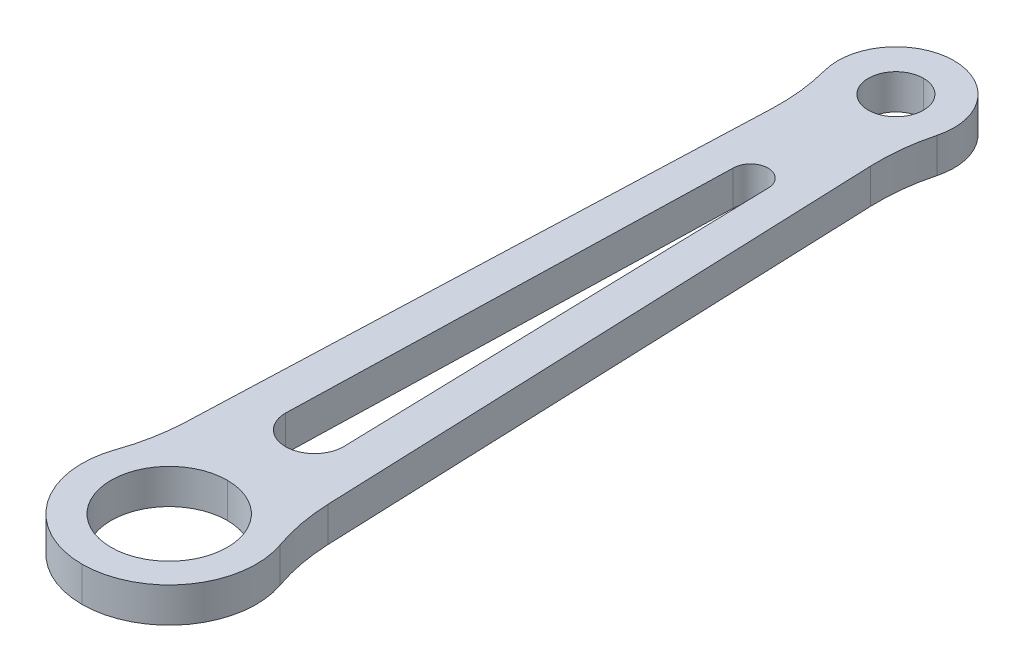
ISO-10303-21;
HEADER;
FILE_DESCRIPTION(('STEP AP214'),'2;1');
FILE_NAME('part.step','',(''),(''),'','','');
FILE_SCHEMA(('AUTOMOTIVE_DESIGN { 1 0 10303 214 1 1 1 1 }'));
ENDSEC;
DATA;
#1=APPLICATION_CONTEXT('core data for automotive mechanical design processes');
#2=APPLICATION_PROTOCOL_DEFINITION('international standard','automotive_design',2000,#1);
#3=PRODUCT_CONTEXT('',#1,'mechanical');
#4=PRODUCT('Part','Part','',(#3));
#5=PRODUCT_RELATED_PRODUCT_CATEGORY('part','',(#4));
#6=PRODUCT_DEFINITION_FORMATION('','',#4);
#7=PRODUCT_DEFINITION_CONTEXT('part definition',#1,'design');
#8=PRODUCT_DEFINITION('design','',#6,#7);
#9=PRODUCT_DEFINITION_SHAPE('','',#8);
#10=(LENGTH_UNIT() NAMED_UNIT(*) SI_UNIT(.MILLI.,.METRE.));
#11=(NAMED_UNIT(*) PLANE_ANGLE_UNIT() SI_UNIT($,.RADIAN.));
#12=(NAMED_UNIT(*) SI_UNIT($,.STERADIAN.) SOLID_ANGLE_UNIT());
#13=UNCERTAINTY_MEASURE_WITH_UNIT(LENGTH_MEASURE(1.E-05),#10,'distance_accuracy_value','');
#14=(GEOMETRIC_REPRESENTATION_CONTEXT(3) GLOBAL_UNCERTAINTY_ASSIGNED_CONTEXT((#13)) GLOBAL_UNIT_ASSIGNED_CONTEXT((#10,
#11,#12)) REPRESENTATION_CONTEXT('',''));
#15=CARTESIAN_POINT('',(0.,0.,0.));
#16=DIRECTION('',(0.,0.,1.));
#17=DIRECTION('',(1.,0.,0.));
#18=AXIS2_PLACEMENT_3D('',#15,#16,#17);
#19=CARTESIAN_POINT('',(0.,-13.,0.));
#20=DIRECTION('',(0.,1.,0.));
#21=DIRECTION('',(0.,0.,1.));
#22=AXIS2_PLACEMENT_3D('',#19,#20,#21);
#23=CYLINDRICAL_SURFACE('',#22,30.);
#24=CARTESIAN_POINT('',(0.,0.,0.));
#25=DIRECTION('',(0.,1.,0.));
#26=DIRECTION('',(0.,0.,1.));
#27=AXIS2_PLACEMENT_3D('',#24,#25,#26);
#28=CIRCLE('',#27,30.);
#29=CARTESIAN_POINT('',(-28.3278152506677,0.,-9.87597504675045));
#30=VERTEX_POINT('',#29);
#31=CARTESIAN_POINT('',(0.,0.,30.));
#32=VERTEX_POINT('',#31);
#33=EDGE_CURVE('E11',#30,#32,#28,.T.);
#34=ORIENTED_EDGE('',*,*,#33,.T.);
#35=DIRECTION('',(0.,1.,0.));
#36=VECTOR('',#35,1.);
#37=CARTESIAN_POINT('',(0.,-13.,30.));
#38=LINE('',#37,#36);
#39=CARTESIAN_POINT('',(0.,12.,30.));
#40=VERTEX_POINT('',#39);
#41=EDGE_CURVE('E28',#32,#40,#38,.T.);
#42=ORIENTED_EDGE('',*,*,#41,.T.);
#43=CARTESIAN_POINT('',(0.,12.,0.));
#44=DIRECTION('',(0.,1.,0.));
#45=DIRECTION('',(0.,0.,1.));
#46=AXIS2_PLACEMENT_3D('',#43,#44,#45);
#47=CIRCLE('',#46,30.);
#48=CARTESIAN_POINT('',(-28.3278152506677,12.,-9.87597504675045));
#49=VERTEX_POINT('',#48);
#50=EDGE_CURVE('E279',#49,#40,#47,.T.);
#51=ORIENTED_EDGE('',*,*,#50,.F.);
#52=DIRECTION('',(0.,1.,0.));
#53=VECTOR('',#52,1.);
#54=CARTESIAN_POINT('',(-28.3278152506677,-13.,-9.87597504675045));
#55=LINE('',#54,#53);
#56=EDGE_CURVE('E345',#30,#49,#55,.T.);
#57=ORIENTED_EDGE('',*,*,#56,.F.);
#58=EDGE_LOOP('',(#34,#42,#51,#57));
#59=FACE_BOUND('',#58,.T.);
#60=ADVANCED_FACE('F17',(#59),#23,.T.);
#61=CARTESIAN_POINT('',(0.,-13.,-50.));
#62=DIRECTION('',(0.,1.,0.));
#63=DIRECTION('',(0.,0.,1.));
#64=AXIS2_PLACEMENT_3D('',#61,#62,#63);
#65=CYLINDRICAL_SURFACE('',#64,10.);
#66=CARTESIAN_POINT('',(0.,0.,-50.));
#67=DIRECTION('',(0.,1.,0.));
#68=DIRECTION('',(0.,0.,1.));
#69=AXIS2_PLACEMENT_3D('',#66,#67,#68);
#70=CIRCLE('',#69,10.);
#71=CARTESIAN_POINT('',(0.,0.,-40.));
#72=VERTEX_POINT('',#71);
#73=CARTESIAN_POINT('',(10.,0.,-50.));
#74=VERTEX_POINT('',#73);
#75=EDGE_CURVE('E296',#72,#74,#70,.T.);
#76=ORIENTED_EDGE('',*,*,#75,.F.);
#77=DIRECTION('',(0.,1.,0.));
#78=VECTOR('',#77,1.);
#79=CARTESIAN_POINT('',(0.,-13.,-40.));
#80=LINE('',#79,#78);
#81=CARTESIAN_POINT('',(0.,12.,-40.));
#82=VERTEX_POINT('',#81);
#83=EDGE_CURVE('E266',#72,#82,#80,.T.);
#84=ORIENTED_EDGE('',*,*,#83,.T.);
#85=CARTESIAN_POINT('',(0.,12.,-50.));
#86=DIRECTION('',(0.,1.,0.));
#87=DIRECTION('',(0.,0.,1.));
#88=AXIS2_PLACEMENT_3D('',#85,#86,#87);
#89=CIRCLE('',#88,10.);
#90=CARTESIAN_POINT('',(10.,12.,-50.));
#91=VERTEX_POINT('',#90);
#92=EDGE_CURVE('E270',#82,#91,#89,.T.);
#93=ORIENTED_EDGE('',*,*,#92,.T.);
#94=DIRECTION('',(0.,1.,0.));
#95=VECTOR('',#94,1.);
#96=CARTESIAN_POINT('',(10.,-13.,-50.));
#97=LINE('',#96,#95);
#98=EDGE_CURVE('E289',#74,#91,#97,.T.);
#99=ORIENTED_EDGE('',*,*,#98,.F.);
#100=EDGE_LOOP('',(#76,#84,#93,#99));
#101=FACE_BOUND('',#100,.T.);
#102=ADVANCED_FACE('F430',(#101),#65,.F.);
#103=CARTESIAN_POINT('',(0.,-13.,0.));
#104=DIRECTION('',(0.,1.,0.));
#105=DIRECTION('',(0.,0.,1.));
#106=AXIS2_PLACEMENT_3D('',#103,#104,#105);
#107=CYLINDRICAL_SURFACE('',#106,19.9999971966483);
#108=CARTESIAN_POINT('',(0.,0.,0.));
#109=DIRECTION('',(0.,1.,0.));
#110=DIRECTION('',(0.,0.,1.));
#111=AXIS2_PLACEMENT_3D('',#108,#109,#110);
#112=CIRCLE('',#111,19.9999971966483);
#113=CARTESIAN_POINT('',(0.,0.,-19.9999971966483));
#114=VERTEX_POINT('',#113);
#115=CARTESIAN_POINT('',(0.,0.,19.9999971966483));
#116=VERTEX_POINT('',#115);
#117=EDGE_CURVE('E339',#114,#116,#112,.T.);
#118=ORIENTED_EDGE('',*,*,#117,.F.);
#119=DIRECTION('',(0.,1.,0.));
#120=VECTOR('',#119,1.);
#121=CARTESIAN_POINT('',(0.,-13.,-19.9999971966483));
#122=LINE('',#121,#120);
#123=CARTESIAN_POINT('',(0.,12.,-19.9999971966483));
#124=VERTEX_POINT('',#123);
#125=EDGE_CURVE('E283',#114,#124,#122,.T.);
#126=ORIENTED_EDGE('',*,*,#125,.T.);
#127=CARTESIAN_POINT('',(0.,12.,0.));
#128=DIRECTION('',(0.,1.,0.));
#129=DIRECTION('',(0.,0.,1.));
#130=AXIS2_PLACEMENT_3D('',#127,#128,#129);
#131=CIRCLE('',#130,19.9999971966483);
#132=CARTESIAN_POINT('',(0.,12.,19.9999971966483));
#133=VERTEX_POINT('',#132);
#134=EDGE_CURVE('E260',#124,#133,#131,.T.);
#135=ORIENTED_EDGE('',*,*,#134,.T.);
#136=DIRECTION('',(0.,1.,0.));
#137=VECTOR('',#136,1.);
#138=CARTESIAN_POINT('',(0.,-13.,19.9999971966483));
#139=LINE('',#138,#137);
#140=EDGE_CURVE('E234',#116,#133,#139,.T.);
#141=ORIENTED_EDGE('',*,*,#140,.F.);
#142=EDGE_LOOP('',(#118,#126,#135,#141));
#143=FACE_BOUND('',#142,.T.);
#144=ADVANCED_FACE('F447',(#143),#107,.F.);
#145=CARTESIAN_POINT('',(0.,12.,-250.));
#146=DIRECTION('',(0.,-1.,0.));
#147=DIRECTION('',(0.,0.,-1.));
#148=AXIS2_PLACEMENT_3D('',#145,#146,#147);
#149=CYLINDRICAL_SURFACE('',#148,9.5);
#150=CARTESIAN_POINT('',(0.,12.,-250.));
#151=DIRECTION('',(0.,1.,0.));
#152=DIRECTION('',(0.,0.,1.));
#153=AXIS2_PLACEMENT_3D('',#150,#151,#152);
#154=CIRCLE('',#153,9.5);
#155=CARTESIAN_POINT('',(0.,12.,-259.5));
#156=VERTEX_POINT('',#155);
#157=CARTESIAN_POINT('',(0.,12.,-240.5));
#158=VERTEX_POINT('',#157);
#159=EDGE_CURVE('E256',#156,#158,#154,.T.);
#160=ORIENTED_EDGE('',*,*,#159,.T.);
#161=DIRECTION('',(0.,-1.,0.));
#162=VECTOR('',#161,1.);
#163=CARTESIAN_POINT('',(0.,12.,-240.5));
#164=LINE('',#163,#162);
#165=CARTESIAN_POINT('',(0.,0.,-240.5));
#166=VERTEX_POINT('',#165);
#167=EDGE_CURVE('E261',#158,#166,#164,.T.);
#168=ORIENTED_EDGE('',*,*,#167,.T.);
#169=CARTESIAN_POINT('',(0.,0.,-250.));
#170=DIRECTION('',(0.,1.,0.));
#171=DIRECTION('',(0.,0.,1.));
#172=AXIS2_PLACEMENT_3D('',#169,#170,#171);
#173=CIRCLE('',#172,9.5);
#174=CARTESIAN_POINT('',(0.,0.,-259.5));
#175=VERTEX_POINT('',#174);
#176=EDGE_CURVE('E336',#175,#166,#173,.T.);
#177=ORIENTED_EDGE('',*,*,#176,.F.);
#178=DIRECTION('',(0.,-1.,0.));
#179=VECTOR('',#178,1.);
#180=CARTESIAN_POINT('',(0.,12.,-259.5));
#181=LINE('',#180,#179);
#182=EDGE_CURVE('E237',#156,#175,#181,.T.);
#183=ORIENTED_EDGE('',*,*,#182,.F.);
#184=EDGE_LOOP('',(#160,#168,#177,#183));
#185=FACE_BOUND('',#184,.T.);
#186=ADVANCED_FACE('F491',(#185),#149,.F.);
#187=CARTESIAN_POINT('',(0.,12.,0.));
#188=DIRECTION('',(0.,1.,0.));
#189=DIRECTION('',(1.,0.,0.));
#190=AXIS2_PLACEMENT_3D('',#187,#188,#189);
#191=PLANE('',#190);
#192=DIRECTION('',(0.0382406015651433,0.,-0.999268560694239));
#193=VECTOR('',#192,1.);
#194=CARTESIAN_POINT('',(-25.597124885427,12.,-0.979565946993043));
#195=LINE('',#194,#193);
#196=CARTESIAN_POINT('',(-24.4772515869624,12.,-30.2430747129414));
#197=VERTEX_POINT('',#196);
#198=CARTESIAN_POINT('',(-17.0516738536364,12.,-224.281506908194));
#199=VERTEX_POINT('',#198);
#200=EDGE_CURVE('E300',#197,#199,#195,.T.);
#201=ORIENTED_EDGE('',*,*,#200,.F.);
#202=CARTESIAN_POINT('',(-94.4260508355591,12.,-32.9199168225015));
#203=DIRECTION('',(0.,1.,0.));
#204=DIRECTION('',(0.,0.,1.));
#205=AXIS2_PLACEMENT_3D('',#202,#203,#204);
#206=CIRCLE('',#205,70.);
#207=EDGE_CURVE('E250',#49,#197,#206,.T.);
#208=ORIENTED_EDGE('',*,*,#207,.F.);
#209=ORIENTED_EDGE('',*,*,#50,.T.);
#210=CARTESIAN_POINT('',(0.,12.,0.));
#211=DIRECTION('',(0.,1.,0.));
#212=DIRECTION('',(0.,0.,1.));
#213=AXIS2_PLACEMENT_3D('',#210,#211,#212);
#214=CIRCLE('',#213,30.);
#215=CARTESIAN_POINT('',(28.3278152506677,12.,-9.87597504675047));
#216=VERTEX_POINT('',#215);
#217=EDGE_CURVE('E284',#40,#216,#214,.T.);
#218=ORIENTED_EDGE('',*,*,#217,.T.);
#219=CARTESIAN_POINT('',(94.4260508355591,12.,-32.9199168225015));
#220=DIRECTION('',(0.,-1.,0.));
#221=DIRECTION('',(0.,0.,1.));
#222=AXIS2_PLACEMENT_3D('',#219,#220,#221);
#223=CIRCLE('',#222,70.);
#224=CARTESIAN_POINT('',(24.4772515869624,12.,-30.2430747129414));
#225=VERTEX_POINT('',#224);
#226=EDGE_CURVE('E287',#216,#225,#223,.T.);
#227=ORIENTED_EDGE('',*,*,#226,.T.);
#228=DIRECTION('',(-0.0382406015651433,0.,-0.999268560694239));
#229=VECTOR('',#228,1.);
#230=CARTESIAN_POINT('',(25.597124885427,12.,-0.979565946993043));
#231=LINE('',#230,#229);
#232=CARTESIAN_POINT('',(17.0516738536364,12.,-224.281506908194));
#233=VERTEX_POINT('',#232);
#234=EDGE_CURVE('E193',#225,#233,#231,.T.);
#235=ORIENTED_EDGE('',*,*,#234,.T.);
#236=CARTESIAN_POINT('',(87.0004731022332,12.,-226.958349017755));
#237=DIRECTION('',(0.,-1.,0.));
#238=DIRECTION('',(0.,0.,1.));
#239=AXIS2_PLACEMENT_3D('',#236,#237,#238);
#240=CIRCLE('',#239,70.);
#241=CARTESIAN_POINT('',(19.333438467163,12.,-244.879633115056));
#242=VERTEX_POINT('',#241);
#243=EDGE_CURVE('E185',#233,#242,#240,.T.);
#244=ORIENTED_EDGE('',*,*,#243,.T.);
#245=CARTESIAN_POINT('',(0.,12.,-250.));
#246=DIRECTION('',(0.,1.,0.));
#247=DIRECTION('',(0.,0.,1.));
#248=AXIS2_PLACEMENT_3D('',#245,#246,#247);
#249=CIRCLE('',#248,20.);
#250=CARTESIAN_POINT('',(-19.333438467163,12.,-244.879633115056));
#251=VERTEX_POINT('',#250);
#252=EDGE_CURVE('E176',#242,#251,#249,.T.);
#253=ORIENTED_EDGE('',*,*,#252,.T.);
#254=CARTESIAN_POINT('',(-87.0004731022332,12.,-226.958349017755));
#255=DIRECTION('',(0.,1.,0.));
#256=DIRECTION('',(0.,0.,1.));
#257=AXIS2_PLACEMENT_3D('',#254,#255,#256);
#258=CIRCLE('',#257,70.);
#259=EDGE_CURVE('E265',#199,#251,#258,.T.);
#260=ORIENTED_EDGE('',*,*,#259,.F.);
#261=EDGE_LOOP('',(#201,#208,#209,#218,#227,#235,#244,#253,#260));
#262=FACE_BOUND('',#261,.T.);
#263=CARTESIAN_POINT('',(0.,12.,-50.));
#264=DIRECTION('',(0.,1.,0.));
#265=DIRECTION('',(0.,0.,1.));
#266=AXIS2_PLACEMENT_3D('',#263,#264,#265);
#267=CIRCLE('',#266,10.);
#268=CARTESIAN_POINT('',(-10.,12.,-50.));
#269=VERTEX_POINT('',#268);
#270=EDGE_CURVE('E227',#269,#82,#267,.T.);
#271=ORIENTED_EDGE('',*,*,#270,.F.);
#272=DIRECTION('',(-0.0266571902389802,0.,0.999644633961771));
#273=VECTOR('',#272,1.);
#274=CARTESIAN_POINT('',(-11.3252798010303,12.,-0.302007461360805));
#275=LINE('',#274,#273);
#276=CARTESIAN_POINT('',(-6.,12.,-200.));
#277=VERTEX_POINT('',#276);
#278=EDGE_CURVE('E320',#277,#269,#275,.T.);
#279=ORIENTED_EDGE('',*,*,#278,.F.);
#280=CARTESIAN_POINT('',(0.,12.,-200.));
#281=DIRECTION('',(0.,1.,0.));
#282=DIRECTION('',(0.,0.,1.));
#283=AXIS2_PLACEMENT_3D('',#280,#281,#282);
#284=CIRCLE('',#283,6.);
#285=CARTESIAN_POINT('',(6.,12.,-200.));
#286=VERTEX_POINT('',#285);
#287=EDGE_CURVE('E228',#286,#277,#284,.T.);
#288=ORIENTED_EDGE('',*,*,#287,.F.);
#289=DIRECTION('',(0.0266571902389802,0.,0.999644633961771));
#290=VECTOR('',#289,1.);
#291=CARTESIAN_POINT('',(11.3252798010303,12.,-0.302007461360805));
#292=LINE('',#291,#290);
#293=EDGE_CURVE('E186',#286,#91,#292,.T.);
#294=ORIENTED_EDGE('',*,*,#293,.T.);
#295=ORIENTED_EDGE('',*,*,#92,.F.);
#296=EDGE_LOOP('',(#271,#279,#288,#294,#295));
#297=FACE_BOUND('',#296,.T.);
#298=CARTESIAN_POINT('',(0.,12.,0.));
#299=DIRECTION('',(0.,1.,0.));
#300=DIRECTION('',(0.,0.,1.));
#301=AXIS2_PLACEMENT_3D('',#298,#299,#300);
#302=CIRCLE('',#301,19.9999971966483);
#303=EDGE_CURVE('E226',#133,#124,#302,.T.);
#304=ORIENTED_EDGE('',*,*,#303,.F.);
#305=ORIENTED_EDGE('',*,*,#134,.F.);
#306=EDGE_LOOP('',(#304,#305));
#307=FACE_BOUND('',#306,.T.);
#308=ORIENTED_EDGE('',*,*,#159,.F.);
#309=CARTESIAN_POINT('',(0.,12.,-250.));
#310=DIRECTION('',(0.,1.,0.));
#311=DIRECTION('',(0.,0.,1.));
#312=AXIS2_PLACEMENT_3D('',#309,#310,#311);
#313=CIRCLE('',#312,9.5);
#314=EDGE_CURVE('E252',#158,#156,#313,.T.);
#315=ORIENTED_EDGE('',*,*,#314,.F.);
#316=EDGE_LOOP('',(#308,#315));
#317=FACE_BOUND('',#316,.T.);
#318=ADVANCED_FACE('F190',(#262,#297,#307,#317),#191,.T.);
#319=CARTESIAN_POINT('',(0.,0.,0.));
#320=DIRECTION('',(0.,1.,0.));
#321=DIRECTION('',(1.,0.,0.));
#322=AXIS2_PLACEMENT_3D('',#319,#320,#321);
#323=PLANE('',#322);
#324=CARTESIAN_POINT('',(-94.4260508355591,0.,-32.9199168225015));
#325=DIRECTION('',(0.,1.,0.));
#326=DIRECTION('',(0.,0.,1.));
#327=AXIS2_PLACEMENT_3D('',#324,#325,#326);
#328=CIRCLE('',#327,70.);
#329=CARTESIAN_POINT('',(-24.4772515869624,0.,-30.2430747129414));
#330=VERTEX_POINT('',#329);
#331=EDGE_CURVE('E217',#30,#330,#328,.T.);
#332=ORIENTED_EDGE('',*,*,#331,.T.);
#333=DIRECTION('',(0.0382406015651433,0.,-0.999268560694239));
#334=VECTOR('',#333,1.);
#335=CARTESIAN_POINT('',(-25.597124885427,0.,-0.979565946993044));
#336=LINE('',#335,#334);
#337=CARTESIAN_POINT('',(-17.0516738536364,0.,-224.281506908194));
#338=VERTEX_POINT('',#337);
#339=EDGE_CURVE('E221',#330,#338,#336,.T.);
#340=ORIENTED_EDGE('',*,*,#339,.T.);
#341=CARTESIAN_POINT('',(-87.0004731022332,0.,-226.958349017755));
#342=DIRECTION('',(0.,1.,0.));
#343=DIRECTION('',(0.,0.,1.));
#344=AXIS2_PLACEMENT_3D('',#341,#342,#343);
#345=CIRCLE('',#344,70.);
#346=CARTESIAN_POINT('',(-19.333438467163,0.,-244.879633115056));
#347=VERTEX_POINT('',#346);
#348=EDGE_CURVE('E245',#338,#347,#345,.T.);
#349=ORIENTED_EDGE('',*,*,#348,.T.);
#350=CARTESIAN_POINT('',(0.,0.,-250.));
#351=DIRECTION('',(0.,1.,0.));
#352=DIRECTION('',(0.,0.,1.));
#353=AXIS2_PLACEMENT_3D('',#350,#351,#352);
#354=CIRCLE('',#353,20.);
#355=CARTESIAN_POINT('',(19.333438467163,0.,-244.879633115056));
#356=VERTEX_POINT('',#355);
#357=EDGE_CURVE('E155',#356,#347,#354,.T.);
#358=ORIENTED_EDGE('',*,*,#357,.F.);
#359=CARTESIAN_POINT('',(87.0004731022332,0.,-226.958349017755));
#360=DIRECTION('',(0.,-1.,0.));
#361=DIRECTION('',(0.,0.,1.));
#362=AXIS2_PLACEMENT_3D('',#359,#360,#361);
#363=CIRCLE('',#362,70.);
#364=CARTESIAN_POINT('',(17.0516738536364,0.,-224.281506908194));
#365=VERTEX_POINT('',#364);
#366=EDGE_CURVE('E200',#365,#356,#363,.T.);
#367=ORIENTED_EDGE('',*,*,#366,.F.);
#368=DIRECTION('',(-0.0382406015651433,0.,-0.999268560694239));
#369=VECTOR('',#368,1.);
#370=CARTESIAN_POINT('',(25.597124885427,0.,-0.979565946993044));
#371=LINE('',#370,#369);
#372=CARTESIAN_POINT('',(24.4772515869624,0.,-30.2430747129414));
#373=VERTEX_POINT('',#372);
#374=EDGE_CURVE('E301',#373,#365,#371,.T.);
#375=ORIENTED_EDGE('',*,*,#374,.F.);
#376=CARTESIAN_POINT('',(94.4260508355591,0.,-32.9199168225015));
#377=DIRECTION('',(0.,-1.,0.));
#378=DIRECTION('',(0.,0.,1.));
#379=AXIS2_PLACEMENT_3D('',#376,#377,#378);
#380=CIRCLE('',#379,70.);
#381=CARTESIAN_POINT('',(28.3278152506677,0.,-9.87597504675047));
#382=VERTEX_POINT('',#381);
#383=EDGE_CURVE('E314',#382,#373,#380,.T.);
#384=ORIENTED_EDGE('',*,*,#383,.F.);
#385=CARTESIAN_POINT('',(0.,0.,0.));
#386=DIRECTION('',(0.,1.,0.));
#387=DIRECTION('',(0.,0.,1.));
#388=AXIS2_PLACEMENT_3D('',#385,#386,#387);
#389=CIRCLE('',#388,30.);
#390=EDGE_CURVE('E247',#32,#382,#389,.T.);
#391=ORIENTED_EDGE('',*,*,#390,.F.);
#392=ORIENTED_EDGE('',*,*,#33,.F.);
#393=EDGE_LOOP('',(#332,#340,#349,#358,#367,#375,#384,#391,#392));
#394=FACE_BOUND('',#393,.T.);
#395=DIRECTION('',(-0.0266571902389802,0.,0.999644633961771));
#396=VECTOR('',#395,1.);
#397=CARTESIAN_POINT('',(-11.3252798010303,0.,-0.302007461360806));
#398=LINE('',#397,#396);
#399=CARTESIAN_POINT('',(-6.,0.,-200.));
#400=VERTEX_POINT('',#399);
#401=CARTESIAN_POINT('',(-10.,0.,-50.));
#402=VERTEX_POINT('',#401);
#403=EDGE_CURVE('E241',#400,#402,#398,.T.);
#404=ORIENTED_EDGE('',*,*,#403,.T.);
#405=CARTESIAN_POINT('',(0.,0.,-50.));
#406=DIRECTION('',(0.,1.,0.));
#407=DIRECTION('',(0.,0.,1.));
#408=AXIS2_PLACEMENT_3D('',#405,#406,#407);
#409=CIRCLE('',#408,10.);
#410=EDGE_CURVE('E246',#402,#72,#409,.T.);
#411=ORIENTED_EDGE('',*,*,#410,.T.);
#412=ORIENTED_EDGE('',*,*,#75,.T.);
#413=DIRECTION('',(0.0266571902389802,0.,0.999644633961771));
#414=VECTOR('',#413,1.);
#415=CARTESIAN_POINT('',(11.3252798010303,0.,-0.302007461360806));
#416=LINE('',#415,#414);
#417=CARTESIAN_POINT('',(6.,0.,-200.));
#418=VERTEX_POINT('',#417);
#419=EDGE_CURVE('E233',#418,#74,#416,.T.);
#420=ORIENTED_EDGE('',*,*,#419,.F.);
#421=CARTESIAN_POINT('',(0.,0.,-200.));
#422=DIRECTION('',(0.,1.,0.));
#423=DIRECTION('',(0.,0.,1.));
#424=AXIS2_PLACEMENT_3D('',#421,#422,#423);
#425=CIRCLE('',#424,6.);
#426=EDGE_CURVE('E293',#418,#400,#425,.T.);
#427=ORIENTED_EDGE('',*,*,#426,.T.);
#428=EDGE_LOOP('',(#404,#411,#412,#420,#427));
#429=FACE_BOUND('',#428,.T.);
#430=CARTESIAN_POINT('',(0.,0.,0.));
#431=DIRECTION('',(0.,1.,0.));
#432=DIRECTION('',(0.,0.,1.));
#433=AXIS2_PLACEMENT_3D('',#430,#431,#432);
#434=CIRCLE('',#433,19.9999971966483);
#435=EDGE_CURVE('E214',#116,#114,#434,.T.);
#436=ORIENTED_EDGE('',*,*,#435,.T.);
#437=ORIENTED_EDGE('',*,*,#117,.T.);
#438=EDGE_LOOP('',(#436,#437));
#439=FACE_BOUND('',#438,.T.);
#440=ORIENTED_EDGE('',*,*,#176,.T.);
#441=CARTESIAN_POINT('',(0.,0.,-250.));
#442=DIRECTION('',(0.,1.,0.));
#443=DIRECTION('',(0.,0.,1.));
#444=AXIS2_PLACEMENT_3D('',#441,#442,#443);
#445=CIRCLE('',#444,9.5);
#446=EDGE_CURVE('E21',#166,#175,#445,.T.);
#447=ORIENTED_EDGE('',*,*,#446,.T.);
#448=EDGE_LOOP('',(#440,#447));
#449=FACE_BOUND('',#448,.T.);
#450=ADVANCED_FACE('F384',(#394,#429,#439,#449),#323,.F.);
#451=CARTESIAN_POINT('',(0.,12.,-250.));
#452=DIRECTION('',(0.,-1.,0.));
#453=DIRECTION('',(0.,0.,-1.));
#454=AXIS2_PLACEMENT_3D('',#451,#452,#453);
#455=CYLINDRICAL_SURFACE('',#454,9.5);
#456=ORIENTED_EDGE('',*,*,#167,.F.);
#457=ORIENTED_EDGE('',*,*,#314,.T.);
#458=ORIENTED_EDGE('',*,*,#182,.T.);
#459=ORIENTED_EDGE('',*,*,#446,.F.);
#460=EDGE_LOOP('',(#456,#457,#458,#459));
#461=FACE_BOUND('',#460,.T.);
#462=ADVANCED_FACE('F19',(#461),#455,.F.);
#463=CARTESIAN_POINT('',(0.,-13.,0.));
#464=DIRECTION('',(0.,1.,0.));
#465=DIRECTION('',(0.,0.,1.));
#466=AXIS2_PLACEMENT_3D('',#463,#464,#465);
#467=CYLINDRICAL_SURFACE('',#466,19.9999971966483);
#468=ORIENTED_EDGE('',*,*,#125,.F.);
#469=ORIENTED_EDGE('',*,*,#435,.F.);
#470=ORIENTED_EDGE('',*,*,#140,.T.);
#471=ORIENTED_EDGE('',*,*,#303,.T.);
#472=EDGE_LOOP('',(#468,#469,#470,#471));
#473=FACE_BOUND('',#472,.T.);
#474=ADVANCED_FACE('F388',(#473),#467,.F.);
#475=CARTESIAN_POINT('',(0.,-13.,-50.));
#476=DIRECTION('',(0.,1.,0.));
#477=DIRECTION('',(0.,0.,1.));
#478=AXIS2_PLACEMENT_3D('',#475,#476,#477);
#479=CYLINDRICAL_SURFACE('',#478,10.);
#480=ORIENTED_EDGE('',*,*,#83,.F.);
#481=ORIENTED_EDGE('',*,*,#410,.F.);
#482=DIRECTION('',(0.,1.,0.));
#483=VECTOR('',#482,1.);
#484=CARTESIAN_POINT('',(-10.,-13.,-50.));
#485=LINE('',#484,#483);
#486=EDGE_CURVE('E222',#402,#269,#485,.T.);
#487=ORIENTED_EDGE('',*,*,#486,.T.);
#488=ORIENTED_EDGE('',*,*,#270,.T.);
#489=EDGE_LOOP('',(#480,#481,#487,#488));
#490=FACE_BOUND('',#489,.T.);
#491=ADVANCED_FACE('F431',(#490),#479,.F.);
#492=CARTESIAN_POINT('',(-11.3252798010303,-13.,-0.302007461360805));
#493=DIRECTION('',(-0.999644633961771,0.,-0.0266571902389802));
#494=DIRECTION('',(-0.0266571902389802,0.,0.999644633961771));
#495=AXIS2_PLACEMENT_3D('',#492,#493,#494);
#496=PLANE('',#495);
#497=DIRECTION('',(0.,1.,0.));
#498=VECTOR('',#497,1.);
#499=CARTESIAN_POINT('',(-6.,-13.,-200.));
#500=LINE('',#499,#498);
#501=EDGE_CURVE('E324',#400,#277,#500,.T.);
#502=ORIENTED_EDGE('',*,*,#501,.T.);
#503=ORIENTED_EDGE('',*,*,#278,.T.);
#504=ORIENTED_EDGE('',*,*,#486,.F.);
#505=ORIENTED_EDGE('',*,*,#403,.F.);
#506=EDGE_LOOP('',(#502,#503,#504,#505));
#507=FACE_BOUND('',#506,.T.);
#508=ADVANCED_FACE('F417',(#507),#496,.F.);
#509=CARTESIAN_POINT('',(0.,-13.,-200.));
#510=DIRECTION('',(0.,1.,0.));
#511=DIRECTION('',(0.,0.,1.));
#512=AXIS2_PLACEMENT_3D('',#509,#510,#511);
#513=CYLINDRICAL_SURFACE('',#512,6.);
#514=DIRECTION('',(0.,1.,0.));
#515=VECTOR('',#514,1.);
#516=CARTESIAN_POINT('',(6.,-13.,-200.));
#517=LINE('',#516,#515);
#518=EDGE_CURVE('E232',#418,#286,#517,.T.);
#519=ORIENTED_EDGE('',*,*,#518,.T.);
#520=ORIENTED_EDGE('',*,*,#287,.T.);
#521=ORIENTED_EDGE('',*,*,#501,.F.);
#522=ORIENTED_EDGE('',*,*,#426,.F.);
#523=EDGE_LOOP('',(#519,#520,#521,#522));
#524=FACE_BOUND('',#523,.T.);
#525=ADVANCED_FACE('F411',(#524),#513,.F.);
#526=CARTESIAN_POINT('',(11.3252798010303,-13.,-0.302007461360805));
#527=DIRECTION('',(-0.999644633961771,0.,0.0266571902389802));
#528=DIRECTION('',(0.,1.,0.));
#529=AXIS2_PLACEMENT_3D('',#526,#527,#528);
#530=PLANE('',#529);
#531=ORIENTED_EDGE('',*,*,#419,.T.);
#532=ORIENTED_EDGE('',*,*,#98,.T.);
#533=ORIENTED_EDGE('',*,*,#293,.F.);
#534=ORIENTED_EDGE('',*,*,#518,.F.);
#535=EDGE_LOOP('',(#531,#532,#533,#534));
#536=FACE_BOUND('',#535,.T.);
#537=ADVANCED_FACE('F428',(#536),#530,.T.);
#538=CARTESIAN_POINT('',(-25.597124885427,-13.,-0.979565946993043));
#539=DIRECTION('',(0.999268560694239,0.,0.0382406015651433));
#540=DIRECTION('',(0.,-1.,0.));
#541=AXIS2_PLACEMENT_3D('',#538,#539,#540);
#542=PLANE('',#541);
#543=DIRECTION('',(0.,1.,0.));
#544=VECTOR('',#543,1.);
#545=CARTESIAN_POINT('',(-24.4772515869624,-13.,-30.2430747129414));
#546=LINE('',#545,#544);
#547=EDGE_CURVE('E292',#330,#197,#546,.T.);
#548=ORIENTED_EDGE('',*,*,#547,.T.);
#549=ORIENTED_EDGE('',*,*,#200,.T.);
#550=DIRECTION('',(0.,1.,0.));
#551=VECTOR('',#550,1.);
#552=CARTESIAN_POINT('',(-17.0516738536364,-13.,-224.281506908194));
#553=LINE('',#552,#551);
#554=EDGE_CURVE('E216',#338,#199,#553,.T.);
#555=ORIENTED_EDGE('',*,*,#554,.F.);
#556=ORIENTED_EDGE('',*,*,#339,.F.);
#557=EDGE_LOOP('',(#548,#549,#555,#556));
#558=FACE_BOUND('',#557,.T.);
#559=ADVANCED_FACE('F456',(#558),#542,.F.);
#560=CARTESIAN_POINT('',(-94.4260508355591,-13.,-32.9199168225015));
#561=DIRECTION('',(0.,1.,0.));
#562=DIRECTION('',(0.,0.,1.));
#563=AXIS2_PLACEMENT_3D('',#560,#561,#562);
#564=CYLINDRICAL_SURFACE('',#563,70.);
#565=ORIENTED_EDGE('',*,*,#56,.T.);
#566=ORIENTED_EDGE('',*,*,#207,.T.);
#567=ORIENTED_EDGE('',*,*,#547,.F.);
#568=ORIENTED_EDGE('',*,*,#331,.F.);
#569=EDGE_LOOP('',(#565,#566,#567,#568));
#570=FACE_BOUND('',#569,.T.);
#571=ADVANCED_FACE('F452',(#570),#564,.F.);
#572=CARTESIAN_POINT('',(0.,-13.,0.));
#573=DIRECTION('',(0.,1.,0.));
#574=DIRECTION('',(0.,0.,1.));
#575=AXIS2_PLACEMENT_3D('',#572,#573,#574);
#576=CYLINDRICAL_SURFACE('',#575,30.);
#577=ORIENTED_EDGE('',*,*,#41,.F.);
#578=ORIENTED_EDGE('',*,*,#390,.T.);
#579=DIRECTION('',(0.,1.,0.));
#580=VECTOR('',#579,1.);
#581=CARTESIAN_POINT('',(28.3278152506677,-13.,-9.87597504675047));
#582=LINE('',#581,#580);
#583=EDGE_CURVE('E251',#382,#216,#582,.T.);
#584=ORIENTED_EDGE('',*,*,#583,.T.);
#585=ORIENTED_EDGE('',*,*,#217,.F.);
#586=EDGE_LOOP('',(#577,#578,#584,#585));
#587=FACE_BOUND('',#586,.T.);
#588=ADVANCED_FACE('F455',(#587),#576,.T.);
#589=CARTESIAN_POINT('',(94.4260508355591,-13.,-32.9199168225015));
#590=DIRECTION('',(0.,1.,0.));
#591=DIRECTION('',(0.,0.,1.));
#592=AXIS2_PLACEMENT_3D('',#589,#590,#591);
#593=CYLINDRICAL_SURFACE('',#592,70.);
#594=ORIENTED_EDGE('',*,*,#383,.T.);
#595=DIRECTION('',(0.,1.,0.));
#596=VECTOR('',#595,1.);
#597=CARTESIAN_POINT('',(24.4772515869624,-13.,-30.2430747129414));
#598=LINE('',#597,#596);
#599=EDGE_CURVE('E304',#373,#225,#598,.T.);
#600=ORIENTED_EDGE('',*,*,#599,.T.);
#601=ORIENTED_EDGE('',*,*,#226,.F.);
#602=ORIENTED_EDGE('',*,*,#583,.F.);
#603=EDGE_LOOP('',(#594,#600,#601,#602));
#604=FACE_BOUND('',#603,.T.);
#605=ADVANCED_FACE('F459',(#604),#593,.F.);
#606=CARTESIAN_POINT('',(25.597124885427,-13.,-0.979565946993043));
#607=DIRECTION('',(0.999268560694239,0.,-0.0382406015651433));
#608=DIRECTION('',(0.,-1.,0.));
#609=AXIS2_PLACEMENT_3D('',#606,#607,#608);
#610=PLANE('',#609);
#611=ORIENTED_EDGE('',*,*,#374,.T.);
#612=DIRECTION('',(0.,1.,0.));
#613=VECTOR('',#612,1.);
#614=CARTESIAN_POINT('',(17.0516738536364,-13.,-224.281506908194));
#615=LINE('',#614,#613);
#616=EDGE_CURVE('E208',#365,#233,#615,.T.);
#617=ORIENTED_EDGE('',*,*,#616,.T.);
#618=ORIENTED_EDGE('',*,*,#234,.F.);
#619=ORIENTED_EDGE('',*,*,#599,.F.);
#620=EDGE_LOOP('',(#611,#617,#618,#619));
#621=FACE_BOUND('',#620,.T.);
#622=ADVANCED_FACE('F483',(#621),#610,.T.);
#623=CARTESIAN_POINT('',(87.0004731022332,-13.,-226.958349017755));
#624=DIRECTION('',(0.,1.,0.));
#625=DIRECTION('',(0.,0.,1.));
#626=AXIS2_PLACEMENT_3D('',#623,#624,#625);
#627=CYLINDRICAL_SURFACE('',#626,70.);
#628=ORIENTED_EDGE('',*,*,#366,.T.);
#629=DIRECTION('',(0.,1.,0.));
#630=VECTOR('',#629,1.);
#631=CARTESIAN_POINT('',(19.333438467163,-13.,-244.879633115056));
#632=LINE('',#631,#630);
#633=EDGE_CURVE('E180',#356,#242,#632,.T.);
#634=ORIENTED_EDGE('',*,*,#633,.T.);
#635=ORIENTED_EDGE('',*,*,#243,.F.);
#636=ORIENTED_EDGE('',*,*,#616,.F.);
#637=EDGE_LOOP('',(#628,#634,#635,#636));
#638=FACE_BOUND('',#637,.T.);
#639=ADVANCED_FACE('F199',(#638),#627,.F.);
#640=CARTESIAN_POINT('',(0.,-13.,-250.));
#641=DIRECTION('',(0.,1.,0.));
#642=DIRECTION('',(0.,0.,1.));
#643=AXIS2_PLACEMENT_3D('',#640,#641,#642);
#644=CYLINDRICAL_SURFACE('',#643,20.);
#645=ORIENTED_EDGE('',*,*,#357,.T.);
#646=DIRECTION('',(0.,1.,0.));
#647=VECTOR('',#646,1.);
#648=CARTESIAN_POINT('',(-19.333438467163,-13.,-244.879633115056));
#649=LINE('',#648,#647);
#650=EDGE_CURVE('E182',#347,#251,#649,.T.);
#651=ORIENTED_EDGE('',*,*,#650,.T.);
#652=ORIENTED_EDGE('',*,*,#252,.F.);
#653=ORIENTED_EDGE('',*,*,#633,.F.);
#654=EDGE_LOOP('',(#645,#651,#652,#653));
#655=FACE_BOUND('',#654,.T.);
#656=ADVANCED_FACE('F178',(#655),#644,.T.);
#657=CARTESIAN_POINT('',(-87.0004731022332,-13.,-226.958349017755));
#658=DIRECTION('',(0.,1.,0.));
#659=DIRECTION('',(0.,0.,1.));
#660=AXIS2_PLACEMENT_3D('',#657,#658,#659);
#661=CYLINDRICAL_SURFACE('',#660,70.);
#662=ORIENTED_EDGE('',*,*,#554,.T.);
#663=ORIENTED_EDGE('',*,*,#259,.T.);
#664=ORIENTED_EDGE('',*,*,#650,.F.);
#665=ORIENTED_EDGE('',*,*,#348,.F.);
#666=EDGE_LOOP('',(#662,#663,#664,#665));
#667=FACE_BOUND('',#666,.T.);
#668=ADVANCED_FACE('F460',(#667),#661,.F.);
#669=CLOSED_SHELL('',(#60,#102,#144,#186,#318,#450,#462,#474,#491,#508,#525,#537,#559,#571,#588,
#605,#622,#639,#656,#668));
#670=MANIFOLD_SOLID_BREP('B1',#669);
#671=ADVANCED_BREP_SHAPE_REPRESENTATION('',(#18,#670),#14);
#672=SHAPE_DEFINITION_REPRESENTATION(#9,#671);
ENDSEC;
END-ISO-10303-21;
